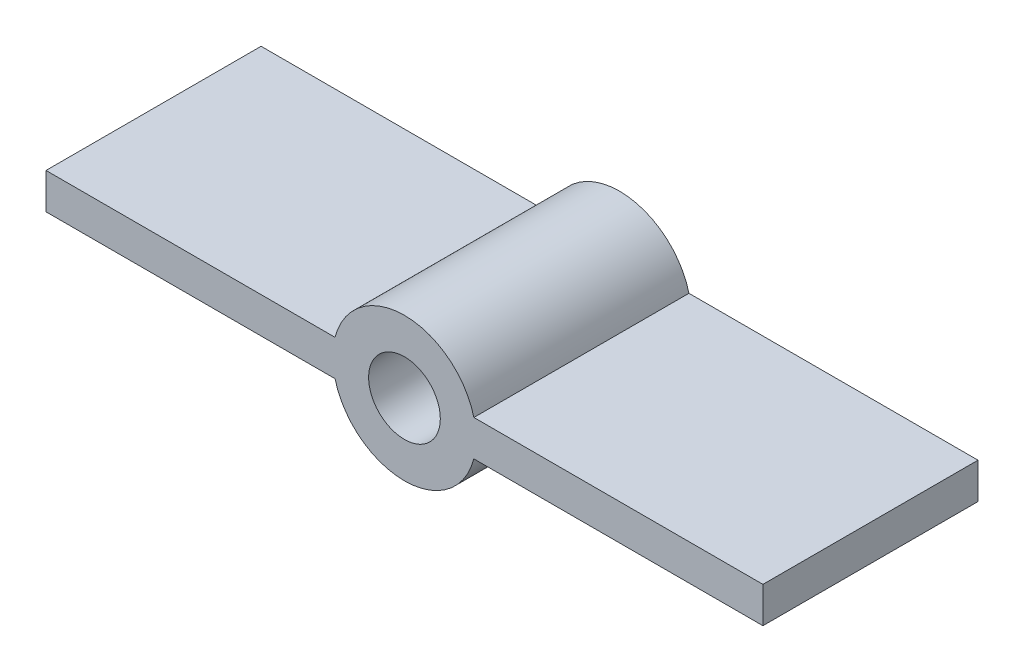
ISO-10303-21;
HEADER;
FILE_DESCRIPTION(('STEP AP214'),'2;1');
FILE_NAME('part.step','',(''),(''),'','','');
FILE_SCHEMA(('AUTOMOTIVE_DESIGN { 1 0 10303 214 1 1 1 1 }'));
ENDSEC;
DATA;
#1=APPLICATION_CONTEXT('core data for automotive mechanical design processes');
#2=APPLICATION_PROTOCOL_DEFINITION('international standard','automotive_design',2000,#1);
#3=PRODUCT_CONTEXT('',#1,'mechanical');
#4=PRODUCT('Part','Part','',(#3));
#5=PRODUCT_RELATED_PRODUCT_CATEGORY('part','',(#4));
#6=PRODUCT_DEFINITION_FORMATION('','',#4);
#7=PRODUCT_DEFINITION_CONTEXT('part definition',#1,'design');
#8=PRODUCT_DEFINITION('design','',#6,#7);
#9=PRODUCT_DEFINITION_SHAPE('','',#8);
#10=(LENGTH_UNIT() NAMED_UNIT(*) SI_UNIT(.MILLI.,.METRE.));
#11=(NAMED_UNIT(*) PLANE_ANGLE_UNIT() SI_UNIT($,.RADIAN.));
#12=(NAMED_UNIT(*) SI_UNIT($,.STERADIAN.) SOLID_ANGLE_UNIT());
#13=UNCERTAINTY_MEASURE_WITH_UNIT(LENGTH_MEASURE(1.E-05),#10,'distance_accuracy_value','');
#14=(GEOMETRIC_REPRESENTATION_CONTEXT(3) GLOBAL_UNCERTAINTY_ASSIGNED_CONTEXT((#13)) GLOBAL_UNIT_ASSIGNED_CONTEXT((#10,
#11,#12)) REPRESENTATION_CONTEXT('',''));
#15=CARTESIAN_POINT('',(0.,0.,0.));
#16=DIRECTION('',(0.,0.,1.));
#17=DIRECTION('',(1.,0.,0.));
#18=AXIS2_PLACEMENT_3D('',#15,#16,#17);
#19=CARTESIAN_POINT('',(-63.5,3.175,-19.05));
#20=DIRECTION('',(0.,1.,0.));
#21=DIRECTION('',(0.,0.,1.));
#22=AXIS2_PLACEMENT_3D('',#19,#20,#21);
#23=PLANE('',#22);
#24=DIRECTION('',(0.,0.,1.));
#25=VECTOR('',#24,1.);
#26=CARTESIAN_POINT('',(-12.2967221242085,3.175,-54.9710244842766));
#27=LINE('',#26,#25);
#28=CARTESIAN_POINT('',(-12.2967221242085,3.175,-19.05));
#29=VERTEX_POINT('',#28);
#30=CARTESIAN_POINT('',(-12.2967221242085,3.175,19.05));
#31=VERTEX_POINT('',#30);
#32=EDGE_CURVE('E152',#29,#31,#27,.T.);
#33=ORIENTED_EDGE('',*,*,#32,.F.);
#34=DIRECTION('',(-1.,0.,0.));
#35=VECTOR('',#34,1.);
#36=CARTESIAN_POINT('',(63.5,3.175,-19.05));
#37=LINE('',#36,#35);
#38=CARTESIAN_POINT('',(-63.5,3.175,-19.05));
#39=VERTEX_POINT('',#38);
#40=EDGE_CURVE('E174',#29,#39,#37,.T.);
#41=ORIENTED_EDGE('',*,*,#40,.T.);
#42=DIRECTION('',(0.,0.,1.));
#43=VECTOR('',#42,1.);
#44=CARTESIAN_POINT('',(-63.5,3.175,19.05));
#45=LINE('',#44,#43);
#46=CARTESIAN_POINT('',(-63.5,3.175,19.05));
#47=VERTEX_POINT('',#46);
#48=EDGE_CURVE('E120',#39,#47,#45,.T.);
#49=ORIENTED_EDGE('',*,*,#48,.T.);
#50=DIRECTION('',(1.,0.,0.));
#51=VECTOR('',#50,1.);
#52=CARTESIAN_POINT('',(63.5,3.175,19.05));
#53=LINE('',#52,#51);
#54=EDGE_CURVE('E145',#47,#31,#53,.T.);
#55=ORIENTED_EDGE('',*,*,#54,.T.);
#56=EDGE_LOOP('',(#33,#41,#49,#55));
#57=FACE_BOUND('',#56,.T.);
#58=ADVANCED_FACE('F37',(#57),#23,.T.);
#59=CARTESIAN_POINT('',(-63.5,-3.175,-19.05));
#60=DIRECTION('',(0.,1.,0.));
#61=DIRECTION('',(0.,0.,1.));
#62=AXIS2_PLACEMENT_3D('',#59,#60,#61);
#63=PLANE('',#62);
#64=DIRECTION('',(-1.,0.,0.));
#65=VECTOR('',#64,1.);
#66=CARTESIAN_POINT('',(63.5,-3.175,-19.05));
#67=LINE('',#66,#65);
#68=CARTESIAN_POINT('',(-12.2967221242085,-3.175,-19.05));
#69=VERTEX_POINT('',#68);
#70=CARTESIAN_POINT('',(-63.5,-3.175,-19.05));
#71=VERTEX_POINT('',#70);
#72=EDGE_CURVE('E121',#69,#71,#67,.T.);
#73=ORIENTED_EDGE('',*,*,#72,.F.);
#74=DIRECTION('',(0.,0.,1.));
#75=VECTOR('',#74,1.);
#76=CARTESIAN_POINT('',(-12.2967221242085,-3.175,-54.9710244842766));
#77=LINE('',#76,#75);
#78=CARTESIAN_POINT('',(-12.2967221242085,-3.175,19.05));
#79=VERTEX_POINT('',#78);
#80=EDGE_CURVE('E11',#69,#79,#77,.T.);
#81=ORIENTED_EDGE('',*,*,#80,.T.);
#82=DIRECTION('',(1.,0.,0.));
#83=VECTOR('',#82,1.);
#84=CARTESIAN_POINT('',(63.5,-3.175,19.05));
#85=LINE('',#84,#83);
#86=CARTESIAN_POINT('',(-63.5,-3.175,19.05));
#87=VERTEX_POINT('',#86);
#88=EDGE_CURVE('E143',#87,#79,#85,.T.);
#89=ORIENTED_EDGE('',*,*,#88,.F.);
#90=DIRECTION('',(0.,0.,1.));
#91=VECTOR('',#90,1.);
#92=CARTESIAN_POINT('',(-63.5,-3.175,19.05));
#93=LINE('',#92,#91);
#94=EDGE_CURVE('E149',#71,#87,#93,.T.);
#95=ORIENTED_EDGE('',*,*,#94,.F.);
#96=EDGE_LOOP('',(#73,#81,#89,#95));
#97=FACE_BOUND('',#96,.T.);
#98=ADVANCED_FACE('F179',(#97),#63,.F.);
#99=CARTESIAN_POINT('',(-63.5,3.175,19.05));
#100=DIRECTION('',(1.,0.,0.));
#101=DIRECTION('',(0.,0.,-1.));
#102=AXIS2_PLACEMENT_3D('',#99,#100,#101);
#103=PLANE('',#102);
#104=ORIENTED_EDGE('',*,*,#94,.T.);
#105=DIRECTION('',(0.,-1.,0.));
#106=VECTOR('',#105,1.);
#107=CARTESIAN_POINT('',(-63.5,3.175,19.05));
#108=LINE('',#107,#106);
#109=EDGE_CURVE('E115',#47,#87,#108,.T.);
#110=ORIENTED_EDGE('',*,*,#109,.F.);
#111=ORIENTED_EDGE('',*,*,#48,.F.);
#112=DIRECTION('',(0.,-1.,0.));
#113=VECTOR('',#112,1.);
#114=CARTESIAN_POINT('',(-63.5,3.175,-19.05));
#115=LINE('',#114,#113);
#116=EDGE_CURVE('E130',#39,#71,#115,.T.);
#117=ORIENTED_EDGE('',*,*,#116,.T.);
#118=EDGE_LOOP('',(#104,#110,#111,#117));
#119=FACE_BOUND('',#118,.T.);
#120=ADVANCED_FACE('F39',(#119),#103,.F.);
#121=CARTESIAN_POINT('',(63.5,3.175,19.05));
#122=DIRECTION('',(0.,0.,-1.));
#123=DIRECTION('',(-1.,0.,0.));
#124=AXIS2_PLACEMENT_3D('',#121,#122,#123);
#125=PLANE('',#124);
#126=CARTESIAN_POINT('',(0.,0.,19.05));
#127=DIRECTION('',(0.,0.,1.));
#128=DIRECTION('',(1.,0.,0.));
#129=AXIS2_PLACEMENT_3D('',#126,#127,#128);
#130=CIRCLE('',#129,6.35);
#131=CARTESIAN_POINT('',(6.35,0.,19.05));
#132=VERTEX_POINT('',#131);
#133=EDGE_CURVE('E169',#132,#132,#130,.T.);
#134=ORIENTED_EDGE('',*,*,#133,.F.);
#135=EDGE_LOOP('',(#134));
#136=FACE_BOUND('',#135,.T.);
#137=ORIENTED_EDGE('',*,*,#88,.T.);
#138=CARTESIAN_POINT('',(0.,0.,19.05));
#139=DIRECTION('',(0.,0.,1.));
#140=DIRECTION('',(1.,0.,0.));
#141=AXIS2_PLACEMENT_3D('',#138,#139,#140);
#142=CIRCLE('',#141,12.7);
#143=CARTESIAN_POINT('',(12.2967221242085,-3.175,19.05));
#144=VERTEX_POINT('',#143);
#145=EDGE_CURVE('E164',#79,#144,#142,.T.);
#146=ORIENTED_EDGE('',*,*,#145,.T.);
#147=CARTESIAN_POINT('',(63.5,-3.175,19.05));
#148=VERTEX_POINT('',#147);
#149=EDGE_CURVE('E114',#144,#148,#85,.T.);
#150=ORIENTED_EDGE('',*,*,#149,.T.);
#151=DIRECTION('',(0.,-1.,0.));
#152=VECTOR('',#151,1.);
#153=CARTESIAN_POINT('',(63.5,3.175,19.05));
#154=LINE('',#153,#152);
#155=CARTESIAN_POINT('',(63.5,3.175,19.05));
#156=VERTEX_POINT('',#155);
#157=EDGE_CURVE('E134',#156,#148,#154,.T.);
#158=ORIENTED_EDGE('',*,*,#157,.F.);
#159=CARTESIAN_POINT('',(12.2967221242086,3.175,19.05));
#160=VERTEX_POINT('',#159);
#161=EDGE_CURVE('E124',#160,#156,#53,.T.);
#162=ORIENTED_EDGE('',*,*,#161,.F.);
#163=EDGE_CURVE('E165',#160,#31,#142,.T.);
#164=ORIENTED_EDGE('',*,*,#163,.T.);
#165=ORIENTED_EDGE('',*,*,#54,.F.);
#166=ORIENTED_EDGE('',*,*,#109,.T.);
#167=EDGE_LOOP('',(#137,#146,#150,#158,#162,#164,#165,#166));
#168=FACE_BOUND('',#167,.T.);
#169=ADVANCED_FACE('F142',(#136,#168),#125,.F.);
#170=CARTESIAN_POINT('',(63.5,3.175,19.05));
#171=DIRECTION('',(-1.,0.,0.));
#172=DIRECTION('',(0.,0.,1.));
#173=AXIS2_PLACEMENT_3D('',#170,#171,#172);
#174=PLANE('',#173);
#175=DIRECTION('',(0.,0.,-1.));
#176=VECTOR('',#175,1.);
#177=CARTESIAN_POINT('',(63.5,-3.175,19.05));
#178=LINE('',#177,#176);
#179=CARTESIAN_POINT('',(63.5,-3.175,-19.05));
#180=VERTEX_POINT('',#179);
#181=EDGE_CURVE('E126',#148,#180,#178,.T.);
#182=ORIENTED_EDGE('',*,*,#181,.T.);
#183=DIRECTION('',(0.,-1.,0.));
#184=VECTOR('',#183,1.);
#185=CARTESIAN_POINT('',(63.5,3.175,-19.05));
#186=LINE('',#185,#184);
#187=CARTESIAN_POINT('',(63.5,3.175,-19.05));
#188=VERTEX_POINT('',#187);
#189=EDGE_CURVE('E119',#188,#180,#186,.T.);
#190=ORIENTED_EDGE('',*,*,#189,.F.);
#191=DIRECTION('',(0.,0.,-1.));
#192=VECTOR('',#191,1.);
#193=CARTESIAN_POINT('',(63.5,3.175,19.05));
#194=LINE('',#193,#192);
#195=EDGE_CURVE('E162',#156,#188,#194,.T.);
#196=ORIENTED_EDGE('',*,*,#195,.F.);
#197=ORIENTED_EDGE('',*,*,#157,.T.);
#198=EDGE_LOOP('',(#182,#190,#196,#197));
#199=FACE_BOUND('',#198,.T.);
#200=ADVANCED_FACE('F159',(#199),#174,.F.);
#201=CARTESIAN_POINT('',(63.5,3.175,-19.05));
#202=DIRECTION('',(0.,0.,1.));
#203=DIRECTION('',(1.,0.,0.));
#204=AXIS2_PLACEMENT_3D('',#201,#202,#203);
#205=PLANE('',#204);
#206=CARTESIAN_POINT('',(0.,0.,-19.05));
#207=DIRECTION('',(0.,0.,1.));
#208=DIRECTION('',(1.,0.,0.));
#209=AXIS2_PLACEMENT_3D('',#206,#207,#208);
#210=CIRCLE('',#209,6.35);
#211=CARTESIAN_POINT('',(6.35,0.,-19.05));
#212=VERTEX_POINT('',#211);
#213=EDGE_CURVE('E166',#212,#212,#210,.T.);
#214=ORIENTED_EDGE('',*,*,#213,.T.);
#215=EDGE_LOOP('',(#214));
#216=FACE_BOUND('',#215,.T.);
#217=CARTESIAN_POINT('',(12.2967221242085,-3.175,-19.05));
#218=VERTEX_POINT('',#217);
#219=EDGE_CURVE('E113',#180,#218,#67,.T.);
#220=ORIENTED_EDGE('',*,*,#219,.T.);
#221=CARTESIAN_POINT('',(0.,0.,-19.05));
#222=DIRECTION('',(0.,0.,1.));
#223=DIRECTION('',(1.,0.,0.));
#224=AXIS2_PLACEMENT_3D('',#221,#222,#223);
#225=CIRCLE('',#224,12.7);
#226=EDGE_CURVE('E99',#218,#69,#225,.F.);
#227=ORIENTED_EDGE('',*,*,#226,.T.);
#228=ORIENTED_EDGE('',*,*,#72,.T.);
#229=ORIENTED_EDGE('',*,*,#116,.F.);
#230=ORIENTED_EDGE('',*,*,#40,.F.);
#231=CARTESIAN_POINT('',(12.2967221242086,3.175,-19.05));
#232=VERTEX_POINT('',#231);
#233=EDGE_CURVE('E106',#29,#232,#225,.F.);
#234=ORIENTED_EDGE('',*,*,#233,.T.);
#235=EDGE_CURVE('E52',#188,#232,#37,.T.);
#236=ORIENTED_EDGE('',*,*,#235,.F.);
#237=ORIENTED_EDGE('',*,*,#189,.T.);
#238=EDGE_LOOP('',(#220,#227,#228,#229,#230,#234,#236,#237));
#239=FACE_BOUND('',#238,.T.);
#240=ADVANCED_FACE('F117',(#216,#239),#205,.F.);
#241=DIRECTION('',(0.,0.,1.));
#242=VECTOR('',#241,1.);
#243=CARTESIAN_POINT('',(12.2967221242085,3.175,-54.9710244842766));
#244=LINE('',#243,#242);
#245=EDGE_CURVE('E56',#160,#232,#244,.F.);
#246=ORIENTED_EDGE('',*,*,#245,.F.);
#247=ORIENTED_EDGE('',*,*,#161,.T.);
#248=ORIENTED_EDGE('',*,*,#195,.T.);
#249=ORIENTED_EDGE('',*,*,#235,.T.);
#250=EDGE_LOOP('',(#246,#247,#248,#249));
#251=FACE_BOUND('',#250,.T.);
#252=ADVANCED_FACE('F187',(#251),#23,.T.);
#253=ORIENTED_EDGE('',*,*,#149,.F.);
#254=DIRECTION('',(0.,0.,1.));
#255=VECTOR('',#254,1.);
#256=CARTESIAN_POINT('',(12.2967221242085,-3.175,-54.9710244842766));
#257=LINE('',#256,#255);
#258=EDGE_CURVE('E45',#144,#218,#257,.F.);
#259=ORIENTED_EDGE('',*,*,#258,.T.);
#260=ORIENTED_EDGE('',*,*,#219,.F.);
#261=ORIENTED_EDGE('',*,*,#181,.F.);
#262=EDGE_LOOP('',(#253,#259,#260,#261));
#263=FACE_BOUND('',#262,.T.);
#264=ADVANCED_FACE('F111',(#263),#63,.F.);
#265=CARTESIAN_POINT('',(0.,0.,-54.9710244842766));
#266=DIRECTION('',(0.,0.,1.));
#267=DIRECTION('',(1.,0.,0.));
#268=AXIS2_PLACEMENT_3D('',#265,#266,#267);
#269=CYLINDRICAL_SURFACE('',#268,12.7);
#270=ORIENTED_EDGE('',*,*,#80,.F.);
#271=ORIENTED_EDGE('',*,*,#226,.F.);
#272=ORIENTED_EDGE('',*,*,#258,.F.);
#273=ORIENTED_EDGE('',*,*,#145,.F.);
#274=EDGE_LOOP('',(#270,#271,#272,#273));
#275=FACE_BOUND('',#274,.T.);
#276=ADVANCED_FACE('F101',(#275),#269,.T.);
#277=ORIENTED_EDGE('',*,*,#233,.F.);
#278=ORIENTED_EDGE('',*,*,#32,.T.);
#279=ORIENTED_EDGE('',*,*,#163,.F.);
#280=ORIENTED_EDGE('',*,*,#245,.T.);
#281=EDGE_LOOP('',(#277,#278,#279,#280));
#282=FACE_BOUND('',#281,.T.);
#283=ADVANCED_FACE('F194',(#282),#269,.T.);
#284=CARTESIAN_POINT('',(0.,0.,-19.05));
#285=DIRECTION('',(0.,0.,1.));
#286=DIRECTION('',(1.,0.,0.));
#287=AXIS2_PLACEMENT_3D('',#284,#285,#286);
#288=CYLINDRICAL_SURFACE('',#287,6.35);
#289=ORIENTED_EDGE('',*,*,#213,.F.);
#290=EDGE_LOOP('',(#289));
#291=FACE_BOUND('',#290,.T.);
#292=ORIENTED_EDGE('',*,*,#133,.T.);
#293=EDGE_LOOP('',(#292));
#294=FACE_BOUND('',#293,.T.);
#295=ADVANCED_FACE('F202',(#291,#294),#288,.F.);
#296=CLOSED_SHELL('',(#58,#98,#120,#169,#200,#240,#252,#264,#276,#283,#295));
#297=MANIFOLD_SOLID_BREP('B2',#296);
#298=ADVANCED_BREP_SHAPE_REPRESENTATION('',(#18,#297),#14);
#299=SHAPE_DEFINITION_REPRESENTATION(#9,#298);
ENDSEC;
END-ISO-10303-21;
